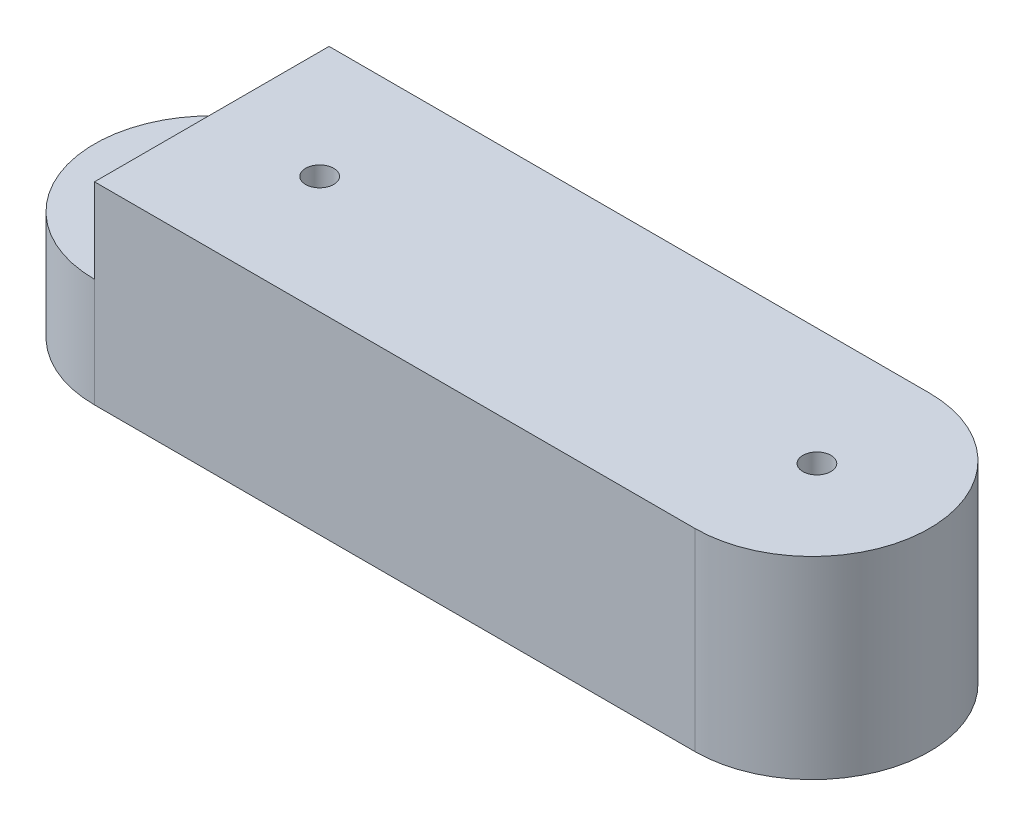
ISO-10303-21;
HEADER;
FILE_DESCRIPTION(('STEP AP214'),'2;1');
FILE_NAME('part.step','',(''),(''),'','','');
FILE_SCHEMA(('AUTOMOTIVE_DESIGN { 1 0 10303 214 1 1 1 1 }'));
ENDSEC;
DATA;
#1=APPLICATION_CONTEXT('core data for automotive mechanical design processes');
#2=APPLICATION_PROTOCOL_DEFINITION('international standard','automotive_design',2000,#1);
#3=PRODUCT_CONTEXT('',#1,'mechanical');
#4=PRODUCT('Part','Part','',(#3));
#5=PRODUCT_RELATED_PRODUCT_CATEGORY('part','',(#4));
#6=PRODUCT_DEFINITION_FORMATION('','',#4);
#7=PRODUCT_DEFINITION_CONTEXT('part definition',#1,'design');
#8=PRODUCT_DEFINITION('design','',#6,#7);
#9=PRODUCT_DEFINITION_SHAPE('','',#8);
#10=(LENGTH_UNIT() NAMED_UNIT(*) SI_UNIT(.MILLI.,.METRE.));
#11=(NAMED_UNIT(*) PLANE_ANGLE_UNIT() SI_UNIT($,.RADIAN.));
#12=(NAMED_UNIT(*) SI_UNIT($,.STERADIAN.) SOLID_ANGLE_UNIT());
#13=UNCERTAINTY_MEASURE_WITH_UNIT(LENGTH_MEASURE(1.E-05),#10,'distance_accuracy_value','');
#14=(GEOMETRIC_REPRESENTATION_CONTEXT(3) GLOBAL_UNCERTAINTY_ASSIGNED_CONTEXT((#13)) GLOBAL_UNIT_ASSIGNED_CONTEXT((#10,
#11,#12)) REPRESENTATION_CONTEXT('',''));
#15=CARTESIAN_POINT('',(0.,0.,0.));
#16=DIRECTION('',(0.,0.,1.));
#17=DIRECTION('',(1.,0.,0.));
#18=AXIS2_PLACEMENT_3D('',#15,#16,#17);
#19=CARTESIAN_POINT('',(0.,20.6,-12.5));
#20=DIRECTION('',(0.,-1.,0.));
#21=DIRECTION('',(0.,0.,-1.));
#22=AXIS2_PLACEMENT_3D('',#19,#20,#21);
#23=CYLINDRICAL_SURFACE('',#22,12.5);
#24=CARTESIAN_POINT('',(0.,11.6,-12.5));
#25=DIRECTION('',(0.,1.,0.));
#26=DIRECTION('',(0.,0.,1.));
#27=AXIS2_PLACEMENT_3D('',#24,#25,#26);
#28=CIRCLE('',#27,12.5);
#29=CARTESIAN_POINT('',(0.,11.6,-25.));
#30=VERTEX_POINT('',#29);
#31=CARTESIAN_POINT('',(0.,11.6,0.));
#32=VERTEX_POINT('',#31);
#33=EDGE_CURVE('E97',#30,#32,#28,.T.);
#34=ORIENTED_EDGE('',*,*,#33,.F.);
#35=DIRECTION('',(0.,-1.,0.));
#36=VECTOR('',#35,1.);
#37=CARTESIAN_POINT('',(0.,20.6,-25.));
#38=LINE('',#37,#36);
#39=CARTESIAN_POINT('',(0.,0.,-25.));
#40=VERTEX_POINT('',#39);
#41=EDGE_CURVE('E83',#30,#40,#38,.T.);
#42=ORIENTED_EDGE('',*,*,#41,.T.);
#43=CARTESIAN_POINT('',(0.,0.,-12.5));
#44=DIRECTION('',(0.,1.,0.));
#45=DIRECTION('',(0.,0.,1.));
#46=AXIS2_PLACEMENT_3D('',#43,#44,#45);
#47=CIRCLE('',#46,12.5);
#48=CARTESIAN_POINT('',(0.,0.,0.));
#49=VERTEX_POINT('',#48);
#50=EDGE_CURVE('E107',#40,#49,#47,.T.);
#51=ORIENTED_EDGE('',*,*,#50,.T.);
#52=DIRECTION('',(0.,-1.,0.));
#53=VECTOR('',#52,1.);
#54=CARTESIAN_POINT('',(0.,20.6,0.));
#55=LINE('',#54,#53);
#56=EDGE_CURVE('E51',#32,#49,#55,.T.);
#57=ORIENTED_EDGE('',*,*,#56,.F.);
#58=EDGE_LOOP('',(#34,#42,#51,#57));
#59=FACE_BOUND('',#58,.T.);
#60=ADVANCED_FACE('F43',(#59),#23,.T.);
#61=CARTESIAN_POINT('',(0.,20.6,0.));
#62=DIRECTION('',(0.,0.,-1.));
#63=DIRECTION('',(-1.,0.,0.));
#64=AXIS2_PLACEMENT_3D('',#61,#62,#63);
#65=PLANE('',#64);
#66=DIRECTION('',(1.,0.,0.));
#67=VECTOR('',#66,1.);
#68=CARTESIAN_POINT('',(0.,0.,0.));
#69=LINE('',#68,#67);
#70=CARTESIAN_POINT('',(64.,0.,0.));
#71=VERTEX_POINT('',#70);
#72=EDGE_CURVE('E129',#49,#71,#69,.T.);
#73=ORIENTED_EDGE('',*,*,#72,.T.);
#74=DIRECTION('',(0.,-1.,0.));
#75=VECTOR('',#74,1.);
#76=CARTESIAN_POINT('',(64.,20.6,0.));
#77=LINE('',#76,#75);
#78=CARTESIAN_POINT('',(64.,20.6,0.));
#79=VERTEX_POINT('',#78);
#80=EDGE_CURVE('E115',#79,#71,#77,.T.);
#81=ORIENTED_EDGE('',*,*,#80,.F.);
#82=DIRECTION('',(1.,0.,0.));
#83=VECTOR('',#82,1.);
#84=CARTESIAN_POINT('',(0.,20.6,0.));
#85=LINE('',#84,#83);
#86=CARTESIAN_POINT('',(0.,20.6,0.));
#87=VERTEX_POINT('',#86);
#88=EDGE_CURVE('E118',#87,#79,#85,.T.);
#89=ORIENTED_EDGE('',*,*,#88,.F.);
#90=EDGE_CURVE('E11',#87,#32,#55,.T.);
#91=ORIENTED_EDGE('',*,*,#90,.T.);
#92=ORIENTED_EDGE('',*,*,#56,.T.);
#93=EDGE_LOOP('',(#73,#81,#89,#91,#92));
#94=FACE_BOUND('',#93,.T.);
#95=ADVANCED_FACE('F111',(#94),#65,.F.);
#96=CARTESIAN_POINT('',(64.,20.6,-12.5));
#97=DIRECTION('',(0.,-1.,0.));
#98=DIRECTION('',(0.,0.,-1.));
#99=AXIS2_PLACEMENT_3D('',#96,#97,#98);
#100=CYLINDRICAL_SURFACE('',#99,12.5);
#101=CARTESIAN_POINT('',(64.,0.,-12.5));
#102=DIRECTION('',(0.,1.,0.));
#103=DIRECTION('',(0.,0.,1.));
#104=AXIS2_PLACEMENT_3D('',#101,#102,#103);
#105=CIRCLE('',#104,12.5);
#106=CARTESIAN_POINT('',(64.,0.,-25.));
#107=VERTEX_POINT('',#106);
#108=EDGE_CURVE('E124',#71,#107,#105,.T.);
#109=ORIENTED_EDGE('',*,*,#108,.T.);
#110=DIRECTION('',(0.,-1.,0.));
#111=VECTOR('',#110,1.);
#112=CARTESIAN_POINT('',(64.,20.6,-25.));
#113=LINE('',#112,#111);
#114=CARTESIAN_POINT('',(64.,20.6,-25.));
#115=VERTEX_POINT('',#114);
#116=EDGE_CURVE('E78',#115,#107,#113,.T.);
#117=ORIENTED_EDGE('',*,*,#116,.F.);
#118=CARTESIAN_POINT('',(64.,20.6,-12.5));
#119=DIRECTION('',(0.,1.,0.));
#120=DIRECTION('',(0.,0.,1.));
#121=AXIS2_PLACEMENT_3D('',#118,#119,#120);
#122=CIRCLE('',#121,12.5);
#123=EDGE_CURVE('E56',#79,#115,#122,.T.);
#124=ORIENTED_EDGE('',*,*,#123,.F.);
#125=ORIENTED_EDGE('',*,*,#80,.T.);
#126=EDGE_LOOP('',(#109,#117,#124,#125));
#127=FACE_BOUND('',#126,.T.);
#128=ADVANCED_FACE('F132',(#127),#100,.T.);
#129=CARTESIAN_POINT('',(0.,20.6,-25.));
#130=DIRECTION('',(0.,0.,-1.));
#131=DIRECTION('',(-1.,0.,0.));
#132=AXIS2_PLACEMENT_3D('',#129,#130,#131);
#133=PLANE('',#132);
#134=DIRECTION('',(1.,0.,0.));
#135=VECTOR('',#134,1.);
#136=CARTESIAN_POINT('',(0.,0.,-25.));
#137=LINE('',#136,#135);
#138=EDGE_CURVE('E116',#40,#107,#137,.T.);
#139=ORIENTED_EDGE('',*,*,#138,.F.);
#140=ORIENTED_EDGE('',*,*,#41,.F.);
#141=CARTESIAN_POINT('',(0.,20.6,-25.));
#142=VERTEX_POINT('',#141);
#143=EDGE_CURVE('E110',#142,#30,#38,.T.);
#144=ORIENTED_EDGE('',*,*,#143,.F.);
#145=DIRECTION('',(1.,0.,0.));
#146=VECTOR('',#145,1.);
#147=CARTESIAN_POINT('',(0.,20.6,-25.));
#148=LINE('',#147,#146);
#149=EDGE_CURVE('E117',#142,#115,#148,.T.);
#150=ORIENTED_EDGE('',*,*,#149,.T.);
#151=ORIENTED_EDGE('',*,*,#116,.T.);
#152=EDGE_LOOP('',(#139,#140,#144,#150,#151));
#153=FACE_BOUND('',#152,.T.);
#154=ADVANCED_FACE('F138',(#153),#133,.T.);
#155=CARTESIAN_POINT('',(0.,20.6,0.));
#156=DIRECTION('',(0.,1.,0.));
#157=DIRECTION('',(0.,0.,1.));
#158=AXIS2_PLACEMENT_3D('',#155,#156,#157);
#159=PLANE('',#158);
#160=CARTESIAN_POINT('',(64.5,20.6,-12.5));
#161=DIRECTION('',(0.,1.,0.));
#162=DIRECTION('',(0.,0.,1.));
#163=AXIS2_PLACEMENT_3D('',#160,#161,#162);
#164=CIRCLE('',#163,1.5);
#165=CARTESIAN_POINT('',(64.5,20.6,-11.));
#166=VERTEX_POINT('',#165);
#167=EDGE_CURVE('E142',#166,#166,#164,.T.);
#168=ORIENTED_EDGE('',*,*,#167,.F.);
#169=EDGE_LOOP('',(#168));
#170=FACE_BOUND('',#169,.T.);
#171=CARTESIAN_POINT('',(11.5,20.6,-12.5));
#172=DIRECTION('',(0.,1.,0.));
#173=DIRECTION('',(0.,0.,1.));
#174=AXIS2_PLACEMENT_3D('',#171,#172,#173);
#175=CIRCLE('',#174,1.5);
#176=CARTESIAN_POINT('',(11.5,20.6,-11.));
#177=VERTEX_POINT('',#176);
#178=EDGE_CURVE('E150',#177,#177,#175,.T.);
#179=ORIENTED_EDGE('',*,*,#178,.F.);
#180=EDGE_LOOP('',(#179));
#181=FACE_BOUND('',#180,.T.);
#182=DIRECTION('',(0.,0.,-1.));
#183=VECTOR('',#182,1.);
#184=CARTESIAN_POINT('',(0.,20.6,0.));
#185=LINE('',#184,#183);
#186=EDGE_CURVE('E103',#87,#142,#185,.T.);
#187=ORIENTED_EDGE('',*,*,#186,.F.);
#188=ORIENTED_EDGE('',*,*,#88,.T.);
#189=ORIENTED_EDGE('',*,*,#123,.T.);
#190=ORIENTED_EDGE('',*,*,#149,.F.);
#191=EDGE_LOOP('',(#187,#188,#189,#190));
#192=FACE_BOUND('',#191,.T.);
#193=ADVANCED_FACE('F137',(#170,#181,#192),#159,.T.);
#194=CARTESIAN_POINT('',(0.,0.,0.));
#195=DIRECTION('',(0.,1.,0.));
#196=DIRECTION('',(0.,0.,1.));
#197=AXIS2_PLACEMENT_3D('',#194,#195,#196);
#198=PLANE('',#197);
#199=ORIENTED_EDGE('',*,*,#50,.F.);
#200=ORIENTED_EDGE('',*,*,#138,.T.);
#201=ORIENTED_EDGE('',*,*,#108,.F.);
#202=ORIENTED_EDGE('',*,*,#72,.F.);
#203=EDGE_LOOP('',(#199,#200,#201,#202));
#204=FACE_BOUND('',#203,.T.);
#205=ADVANCED_FACE('F140',(#204),#198,.F.);
#206=CARTESIAN_POINT('',(0.,11.6,0.));
#207=DIRECTION('',(1.,0.,0.));
#208=DIRECTION('',(0.,0.,-1.));
#209=AXIS2_PLACEMENT_3D('',#206,#207,#208);
#210=PLANE('',#209);
#211=ORIENTED_EDGE('',*,*,#186,.T.);
#212=ORIENTED_EDGE('',*,*,#143,.T.);
#213=DIRECTION('',(0.,0.,-1.));
#214=VECTOR('',#213,1.);
#215=CARTESIAN_POINT('',(0.,11.6,0.));
#216=LINE('',#215,#214);
#217=EDGE_CURVE('E101',#32,#30,#216,.T.);
#218=ORIENTED_EDGE('',*,*,#217,.F.);
#219=ORIENTED_EDGE('',*,*,#90,.F.);
#220=EDGE_LOOP('',(#211,#212,#218,#219));
#221=FACE_BOUND('',#220,.T.);
#222=ADVANCED_FACE('F104',(#221),#210,.F.);
#223=CARTESIAN_POINT('',(0.,11.6,0.));
#224=DIRECTION('',(0.,1.,0.));
#225=DIRECTION('',(0.,0.,1.));
#226=AXIS2_PLACEMENT_3D('',#223,#224,#225);
#227=PLANE('',#226);
#228=ORIENTED_EDGE('',*,*,#33,.T.);
#229=ORIENTED_EDGE('',*,*,#217,.T.);
#230=EDGE_LOOP('',(#228,#229));
#231=FACE_BOUND('',#230,.T.);
#232=ADVANCED_FACE('F99',(#231),#227,.T.);
#233=CARTESIAN_POINT('',(11.5,16.6,-12.5));
#234=DIRECTION('',(0.,1.,0.));
#235=DIRECTION('',(0.,0.,1.));
#236=AXIS2_PLACEMENT_3D('',#233,#234,#235);
#237=CYLINDRICAL_SURFACE('',#236,1.5);
#238=CARTESIAN_POINT('',(11.5,16.6,-12.5));
#239=DIRECTION('',(0.,1.,0.));
#240=DIRECTION('',(0.,0.,1.));
#241=AXIS2_PLACEMENT_3D('',#238,#239,#240);
#242=CIRCLE('',#241,1.5);
#243=CARTESIAN_POINT('',(11.5,16.6,-11.));
#244=VERTEX_POINT('',#243);
#245=EDGE_CURVE('E155',#244,#244,#242,.T.);
#246=ORIENTED_EDGE('',*,*,#245,.F.);
#247=EDGE_LOOP('',(#246));
#248=FACE_BOUND('',#247,.T.);
#249=ORIENTED_EDGE('',*,*,#178,.T.);
#250=EDGE_LOOP('',(#249));
#251=FACE_BOUND('',#250,.T.);
#252=ADVANCED_FACE('F158',(#248,#251),#237,.F.);
#253=CARTESIAN_POINT('',(11.5,16.6,-12.5));
#254=DIRECTION('',(0.,1.,0.));
#255=DIRECTION('',(0.,0.,1.));
#256=AXIS2_PLACEMENT_3D('',#253,#254,#255);
#257=PLANE('',#256);
#258=ORIENTED_EDGE('',*,*,#245,.T.);
#259=EDGE_LOOP('',(#258));
#260=FACE_BOUND('',#259,.T.);
#261=ADVANCED_FACE('F156',(#260),#257,.T.);
#262=CARTESIAN_POINT('',(64.5,16.6,-12.5));
#263=DIRECTION('',(0.,1.,0.));
#264=DIRECTION('',(0.,0.,1.));
#265=AXIS2_PLACEMENT_3D('',#262,#263,#264);
#266=CYLINDRICAL_SURFACE('',#265,1.5);
#267=CARTESIAN_POINT('',(64.5,16.6,-12.5));
#268=DIRECTION('',(0.,1.,0.));
#269=DIRECTION('',(0.,0.,1.));
#270=AXIS2_PLACEMENT_3D('',#267,#268,#269);
#271=CIRCLE('',#270,1.5);
#272=CARTESIAN_POINT('',(64.5,16.6,-11.));
#273=VERTEX_POINT('',#272);
#274=EDGE_CURVE('E139',#273,#273,#271,.T.);
#275=ORIENTED_EDGE('',*,*,#274,.F.);
#276=EDGE_LOOP('',(#275));
#277=FACE_BOUND('',#276,.T.);
#278=ORIENTED_EDGE('',*,*,#167,.T.);
#279=EDGE_LOOP('',(#278));
#280=FACE_BOUND('',#279,.T.);
#281=ADVANCED_FACE('F229',(#277,#280),#266,.F.);
#282=CARTESIAN_POINT('',(64.5,16.6,-12.5));
#283=DIRECTION('',(0.,1.,0.));
#284=DIRECTION('',(0.,0.,1.));
#285=AXIS2_PLACEMENT_3D('',#282,#283,#284);
#286=PLANE('',#285);
#287=ORIENTED_EDGE('',*,*,#274,.T.);
#288=EDGE_LOOP('',(#287));
#289=FACE_BOUND('',#288,.T.);
#290=ADVANCED_FACE('F236',(#289),#286,.T.);
#291=CLOSED_SHELL('',(#60,#95,#128,#154,#193,#205,#222,#232,#252,#261,#281,#290));
#292=MANIFOLD_SOLID_BREP('B2',#291);
#293=ADVANCED_BREP_SHAPE_REPRESENTATION('',(#18,#292),#14);
#294=SHAPE_DEFINITION_REPRESENTATION(#9,#293);
ENDSEC;
END-ISO-10303-21;
